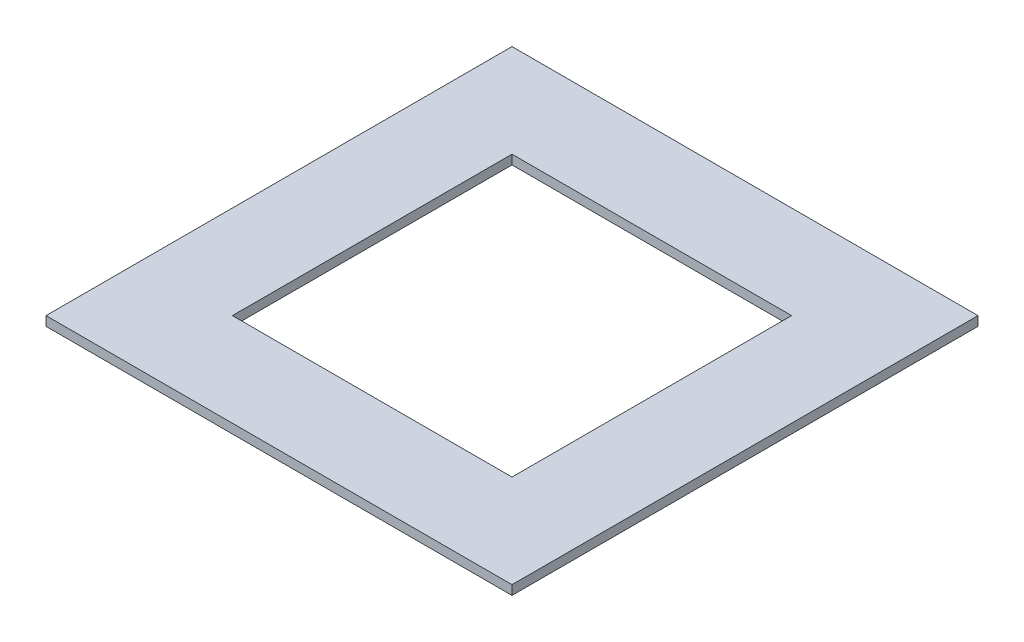
ISO-10303-21;
HEADER;
FILE_DESCRIPTION(('STEP AP214'),'2;1');
FILE_NAME('part.step','',(''),(''),'','','');
FILE_SCHEMA(('AUTOMOTIVE_DESIGN { 1 0 10303 214 1 1 1 1 }'));
ENDSEC;
DATA;
#1=APPLICATION_CONTEXT('core data for automotive mechanical design processes');
#2=APPLICATION_PROTOCOL_DEFINITION('international standard','automotive_design',2000,#1);
#3=PRODUCT_CONTEXT('',#1,'mechanical');
#4=PRODUCT('Part','Part','',(#3));
#5=PRODUCT_RELATED_PRODUCT_CATEGORY('part','',(#4));
#6=PRODUCT_DEFINITION_FORMATION('','',#4);
#7=PRODUCT_DEFINITION_CONTEXT('part definition',#1,'design');
#8=PRODUCT_DEFINITION('design','',#6,#7);
#9=PRODUCT_DEFINITION_SHAPE('','',#8);
#10=(LENGTH_UNIT() NAMED_UNIT(*) SI_UNIT(.MILLI.,.METRE.));
#11=(NAMED_UNIT(*) PLANE_ANGLE_UNIT() SI_UNIT($,.RADIAN.));
#12=(NAMED_UNIT(*) SI_UNIT($,.STERADIAN.) SOLID_ANGLE_UNIT());
#13=UNCERTAINTY_MEASURE_WITH_UNIT(LENGTH_MEASURE(1.E-05),#10,'distance_accuracy_value','');
#14=(GEOMETRIC_REPRESENTATION_CONTEXT(3) GLOBAL_UNCERTAINTY_ASSIGNED_CONTEXT((#13)) GLOBAL_UNIT_ASSIGNED_CONTEXT((#10,
#11,#12)) REPRESENTATION_CONTEXT('',''));
#15=CARTESIAN_POINT('',(0.,0.,0.));
#16=DIRECTION('',(0.,0.,1.));
#17=DIRECTION('',(1.,0.,0.));
#18=AXIS2_PLACEMENT_3D('',#15,#16,#17);
#19=CARTESIAN_POINT('',(0.,0.5,0.));
#20=DIRECTION('',(0.,-1.,0.));
#21=DIRECTION('',(0.,0.,-1.));
#22=AXIS2_PLACEMENT_3D('',#19,#20,#21);
#23=PLANE('',#22);
#24=DIRECTION('',(0.,0.,1.));
#25=VECTOR('',#24,1.);
#26=CARTESIAN_POINT('',(0.,0.5,0.));
#27=LINE('',#26,#25);
#28=CARTESIAN_POINT('',(0.,0.5,-25.));
#29=VERTEX_POINT('',#28);
#30=CARTESIAN_POINT('',(0.,0.5,0.));
#31=VERTEX_POINT('',#30);
#32=EDGE_CURVE('E134',#29,#31,#27,.T.);
#33=ORIENTED_EDGE('',*,*,#32,.T.);
#34=DIRECTION('',(1.,0.,0.));
#35=VECTOR('',#34,1.);
#36=CARTESIAN_POINT('',(0.,0.5,0.));
#37=LINE('',#36,#35);
#38=CARTESIAN_POINT('',(25.,0.5,0.));
#39=VERTEX_POINT('',#38);
#40=EDGE_CURVE('E137',#31,#39,#37,.T.);
#41=ORIENTED_EDGE('',*,*,#40,.T.);
#42=DIRECTION('',(0.,0.,-1.));
#43=VECTOR('',#42,1.);
#44=CARTESIAN_POINT('',(25.,0.5,0.));
#45=LINE('',#44,#43);
#46=CARTESIAN_POINT('',(25.,0.5,-25.));
#47=VERTEX_POINT('',#46);
#48=EDGE_CURVE('E140',#39,#47,#45,.T.);
#49=ORIENTED_EDGE('',*,*,#48,.T.);
#50=DIRECTION('',(-1.,0.,0.));
#51=VECTOR('',#50,1.);
#52=CARTESIAN_POINT('',(0.,0.5,-25.));
#53=LINE('',#52,#51);
#54=EDGE_CURVE('E142',#47,#29,#53,.T.);
#55=ORIENTED_EDGE('',*,*,#54,.T.);
#56=EDGE_LOOP('',(#33,#41,#49,#55));
#57=FACE_BOUND('',#56,.T.);
#58=DIRECTION('',(0.,0.,1.));
#59=VECTOR('',#58,1.);
#60=CARTESIAN_POINT('',(5.,0.5,-5.));
#61=LINE('',#60,#59);
#62=CARTESIAN_POINT('',(5.,0.5,-20.));
#63=VERTEX_POINT('',#62);
#64=CARTESIAN_POINT('',(5.,0.5,-5.));
#65=VERTEX_POINT('',#64);
#66=EDGE_CURVE('E98',#63,#65,#61,.T.);
#67=ORIENTED_EDGE('',*,*,#66,.F.);
#68=DIRECTION('',(-1.,0.,0.));
#69=VECTOR('',#68,1.);
#70=CARTESIAN_POINT('',(5.,0.5,-20.));
#71=LINE('',#70,#69);
#72=CARTESIAN_POINT('',(20.,0.5,-20.));
#73=VERTEX_POINT('',#72);
#74=EDGE_CURVE('E120',#73,#63,#71,.T.);
#75=ORIENTED_EDGE('',*,*,#74,.F.);
#76=DIRECTION('',(0.,0.,-1.));
#77=VECTOR('',#76,1.);
#78=CARTESIAN_POINT('',(20.,0.5,-5.));
#79=LINE('',#78,#77);
#80=CARTESIAN_POINT('',(20.,0.5,-5.));
#81=VERTEX_POINT('',#80);
#82=EDGE_CURVE('E118',#81,#73,#79,.T.);
#83=ORIENTED_EDGE('',*,*,#82,.F.);
#84=DIRECTION('',(1.,0.,0.));
#85=VECTOR('',#84,1.);
#86=CARTESIAN_POINT('',(5.,0.5,-5.));
#87=LINE('',#86,#85);
#88=EDGE_CURVE('E106',#65,#81,#87,.T.);
#89=ORIENTED_EDGE('',*,*,#88,.F.);
#90=EDGE_LOOP('',(#67,#75,#83,#89));
#91=FACE_BOUND('',#90,.T.);
#92=ADVANCED_FACE('F33',(#57,#91),#23,.F.);
#93=CARTESIAN_POINT('',(0.,0.,0.));
#94=DIRECTION('',(0.,-1.,0.));
#95=DIRECTION('',(0.,0.,-1.));
#96=AXIS2_PLACEMENT_3D('',#93,#94,#95);
#97=PLANE('',#96);
#98=DIRECTION('',(0.,0.,1.));
#99=VECTOR('',#98,1.);
#100=CARTESIAN_POINT('',(0.,0.,0.));
#101=LINE('',#100,#99);
#102=CARTESIAN_POINT('',(0.,0.,-25.));
#103=VERTEX_POINT('',#102);
#104=CARTESIAN_POINT('',(0.,0.,0.));
#105=VERTEX_POINT('',#104);
#106=EDGE_CURVE('E114',#103,#105,#101,.T.);
#107=ORIENTED_EDGE('',*,*,#106,.F.);
#108=DIRECTION('',(-1.,0.,0.));
#109=VECTOR('',#108,1.);
#110=CARTESIAN_POINT('',(0.,0.,-25.));
#111=LINE('',#110,#109);
#112=CARTESIAN_POINT('',(25.,0.,-25.));
#113=VERTEX_POINT('',#112);
#114=EDGE_CURVE('E138',#113,#103,#111,.T.);
#115=ORIENTED_EDGE('',*,*,#114,.F.);
#116=DIRECTION('',(0.,0.,-1.));
#117=VECTOR('',#116,1.);
#118=CARTESIAN_POINT('',(25.,0.,0.));
#119=LINE('',#118,#117);
#120=CARTESIAN_POINT('',(25.,0.,0.));
#121=VERTEX_POINT('',#120);
#122=EDGE_CURVE('E149',#121,#113,#119,.T.);
#123=ORIENTED_EDGE('',*,*,#122,.F.);
#124=DIRECTION('',(1.,0.,0.));
#125=VECTOR('',#124,1.);
#126=CARTESIAN_POINT('',(0.,0.,0.));
#127=LINE('',#126,#125);
#128=EDGE_CURVE('E147',#105,#121,#127,.T.);
#129=ORIENTED_EDGE('',*,*,#128,.F.);
#130=EDGE_LOOP('',(#107,#115,#123,#129));
#131=FACE_BOUND('',#130,.T.);
#132=DIRECTION('',(-1.,0.,0.));
#133=VECTOR('',#132,1.);
#134=CARTESIAN_POINT('',(5.,0.,-20.));
#135=LINE('',#134,#133);
#136=CARTESIAN_POINT('',(20.,0.,-20.));
#137=VERTEX_POINT('',#136);
#138=CARTESIAN_POINT('',(5.,0.,-20.));
#139=VERTEX_POINT('',#138);
#140=EDGE_CURVE('E107',#137,#139,#135,.T.);
#141=ORIENTED_EDGE('',*,*,#140,.T.);
#142=DIRECTION('',(0.,0.,1.));
#143=VECTOR('',#142,1.);
#144=CARTESIAN_POINT('',(5.,0.,-5.));
#145=LINE('',#144,#143);
#146=CARTESIAN_POINT('',(5.,0.,-5.));
#147=VERTEX_POINT('',#146);
#148=EDGE_CURVE('E56',#139,#147,#145,.T.);
#149=ORIENTED_EDGE('',*,*,#148,.T.);
#150=DIRECTION('',(1.,0.,0.));
#151=VECTOR('',#150,1.);
#152=CARTESIAN_POINT('',(5.,0.,-5.));
#153=LINE('',#152,#151);
#154=CARTESIAN_POINT('',(20.,0.,-5.));
#155=VERTEX_POINT('',#154);
#156=EDGE_CURVE('E113',#147,#155,#153,.T.);
#157=ORIENTED_EDGE('',*,*,#156,.T.);
#158=DIRECTION('',(0.,0.,-1.));
#159=VECTOR('',#158,1.);
#160=CARTESIAN_POINT('',(20.,0.,-5.));
#161=LINE('',#160,#159);
#162=EDGE_CURVE('E126',#155,#137,#161,.T.);
#163=ORIENTED_EDGE('',*,*,#162,.T.);
#164=EDGE_LOOP('',(#141,#149,#157,#163));
#165=FACE_BOUND('',#164,.T.);
#166=ADVANCED_FACE('F167',(#131,#165),#97,.T.);
#167=CARTESIAN_POINT('',(0.,0.5,0.));
#168=DIRECTION('',(1.,0.,0.));
#169=DIRECTION('',(0.,0.,-1.));
#170=AXIS2_PLACEMENT_3D('',#167,#168,#169);
#171=PLANE('',#170);
#172=ORIENTED_EDGE('',*,*,#106,.T.);
#173=DIRECTION('',(0.,-1.,0.));
#174=VECTOR('',#173,1.);
#175=CARTESIAN_POINT('',(0.,0.5,0.));
#176=LINE('',#175,#174);
#177=EDGE_CURVE('E11',#31,#105,#176,.T.);
#178=ORIENTED_EDGE('',*,*,#177,.F.);
#179=ORIENTED_EDGE('',*,*,#32,.F.);
#180=DIRECTION('',(0.,-1.,0.));
#181=VECTOR('',#180,1.);
#182=CARTESIAN_POINT('',(0.,0.5,-25.));
#183=LINE('',#182,#181);
#184=EDGE_CURVE('E144',#29,#103,#183,.T.);
#185=ORIENTED_EDGE('',*,*,#184,.T.);
#186=EDGE_LOOP('',(#172,#178,#179,#185));
#187=FACE_BOUND('',#186,.T.);
#188=ADVANCED_FACE('F35',(#187),#171,.F.);
#189=CARTESIAN_POINT('',(0.,0.5,0.));
#190=DIRECTION('',(0.,0.,-1.));
#191=DIRECTION('',(-1.,0.,0.));
#192=AXIS2_PLACEMENT_3D('',#189,#190,#191);
#193=PLANE('',#192);
#194=ORIENTED_EDGE('',*,*,#128,.T.);
#195=DIRECTION('',(0.,-1.,0.));
#196=VECTOR('',#195,1.);
#197=CARTESIAN_POINT('',(25.,0.5,0.));
#198=LINE('',#197,#196);
#199=EDGE_CURVE('E41',#39,#121,#198,.T.);
#200=ORIENTED_EDGE('',*,*,#199,.F.);
#201=ORIENTED_EDGE('',*,*,#40,.F.);
#202=ORIENTED_EDGE('',*,*,#177,.T.);
#203=EDGE_LOOP('',(#194,#200,#201,#202));
#204=FACE_BOUND('',#203,.T.);
#205=ADVANCED_FACE('F177',(#204),#193,.F.);
#206=CARTESIAN_POINT('',(25.,0.5,0.));
#207=DIRECTION('',(-1.,0.,0.));
#208=DIRECTION('',(0.,0.,1.));
#209=AXIS2_PLACEMENT_3D('',#206,#207,#208);
#210=PLANE('',#209);
#211=ORIENTED_EDGE('',*,*,#122,.T.);
#212=DIRECTION('',(0.,-1.,0.));
#213=VECTOR('',#212,1.);
#214=CARTESIAN_POINT('',(25.,0.5,-25.));
#215=LINE('',#214,#213);
#216=EDGE_CURVE('E154',#47,#113,#215,.T.);
#217=ORIENTED_EDGE('',*,*,#216,.F.);
#218=ORIENTED_EDGE('',*,*,#48,.F.);
#219=ORIENTED_EDGE('',*,*,#199,.T.);
#220=EDGE_LOOP('',(#211,#217,#218,#219));
#221=FACE_BOUND('',#220,.T.);
#222=ADVANCED_FACE('F161',(#221),#210,.F.);
#223=CARTESIAN_POINT('',(0.,0.5,-25.));
#224=DIRECTION('',(0.,0.,1.));
#225=DIRECTION('',(1.,0.,0.));
#226=AXIS2_PLACEMENT_3D('',#223,#224,#225);
#227=PLANE('',#226);
#228=ORIENTED_EDGE('',*,*,#114,.T.);
#229=ORIENTED_EDGE('',*,*,#184,.F.);
#230=ORIENTED_EDGE('',*,*,#54,.F.);
#231=ORIENTED_EDGE('',*,*,#216,.T.);
#232=EDGE_LOOP('',(#228,#229,#230,#231));
#233=FACE_BOUND('',#232,.T.);
#234=ADVANCED_FACE('F171',(#233),#227,.F.);
#235=CARTESIAN_POINT('',(5.,0.5,-5.));
#236=DIRECTION('',(1.,0.,0.));
#237=DIRECTION('',(0.,0.,-1.));
#238=AXIS2_PLACEMENT_3D('',#235,#236,#237);
#239=PLANE('',#238);
#240=ORIENTED_EDGE('',*,*,#148,.F.);
#241=DIRECTION('',(0.,-1.,0.));
#242=VECTOR('',#241,1.);
#243=CARTESIAN_POINT('',(5.,0.5,-20.));
#244=LINE('',#243,#242);
#245=EDGE_CURVE('E102',#63,#139,#244,.T.);
#246=ORIENTED_EDGE('',*,*,#245,.F.);
#247=ORIENTED_EDGE('',*,*,#66,.T.);
#248=DIRECTION('',(0.,-1.,0.));
#249=VECTOR('',#248,1.);
#250=CARTESIAN_POINT('',(5.,0.5,-5.));
#251=LINE('',#250,#249);
#252=EDGE_CURVE('E101',#65,#147,#251,.T.);
#253=ORIENTED_EDGE('',*,*,#252,.T.);
#254=EDGE_LOOP('',(#240,#246,#247,#253));
#255=FACE_BOUND('',#254,.T.);
#256=ADVANCED_FACE('F100',(#255),#239,.T.);
#257=CARTESIAN_POINT('',(5.,0.5,-5.));
#258=DIRECTION('',(0.,0.,-1.));
#259=DIRECTION('',(-1.,0.,0.));
#260=AXIS2_PLACEMENT_3D('',#257,#258,#259);
#261=PLANE('',#260);
#262=ORIENTED_EDGE('',*,*,#156,.F.);
#263=ORIENTED_EDGE('',*,*,#252,.F.);
#264=ORIENTED_EDGE('',*,*,#88,.T.);
#265=DIRECTION('',(0.,-1.,0.));
#266=VECTOR('',#265,1.);
#267=CARTESIAN_POINT('',(20.,0.5,-5.));
#268=LINE('',#267,#266);
#269=EDGE_CURVE('E115',#81,#155,#268,.T.);
#270=ORIENTED_EDGE('',*,*,#269,.T.);
#271=EDGE_LOOP('',(#262,#263,#264,#270));
#272=FACE_BOUND('',#271,.T.);
#273=ADVANCED_FACE('F110',(#272),#261,.T.);
#274=CARTESIAN_POINT('',(20.,0.5,-5.));
#275=DIRECTION('',(-1.,0.,0.));
#276=DIRECTION('',(0.,0.,1.));
#277=AXIS2_PLACEMENT_3D('',#274,#275,#276);
#278=PLANE('',#277);
#279=ORIENTED_EDGE('',*,*,#162,.F.);
#280=ORIENTED_EDGE('',*,*,#269,.F.);
#281=ORIENTED_EDGE('',*,*,#82,.T.);
#282=DIRECTION('',(0.,-1.,0.));
#283=VECTOR('',#282,1.);
#284=CARTESIAN_POINT('',(20.,0.5,-20.));
#285=LINE('',#284,#283);
#286=EDGE_CURVE('E48',#73,#137,#285,.T.);
#287=ORIENTED_EDGE('',*,*,#286,.T.);
#288=EDGE_LOOP('',(#279,#280,#281,#287));
#289=FACE_BOUND('',#288,.T.);
#290=ADVANCED_FACE('F200',(#289),#278,.T.);
#291=CARTESIAN_POINT('',(5.,0.5,-20.));
#292=DIRECTION('',(0.,0.,1.));
#293=DIRECTION('',(1.,0.,0.));
#294=AXIS2_PLACEMENT_3D('',#291,#292,#293);
#295=PLANE('',#294);
#296=ORIENTED_EDGE('',*,*,#140,.F.);
#297=ORIENTED_EDGE('',*,*,#286,.F.);
#298=ORIENTED_EDGE('',*,*,#74,.T.);
#299=ORIENTED_EDGE('',*,*,#245,.T.);
#300=EDGE_LOOP('',(#296,#297,#298,#299));
#301=FACE_BOUND('',#300,.T.);
#302=ADVANCED_FACE('F204',(#301),#295,.T.);
#303=CLOSED_SHELL('',(#92,#166,#188,#205,#222,#234,#256,#273,#290,#302));
#304=MANIFOLD_SOLID_BREP('B2',#303);
#305=ADVANCED_BREP_SHAPE_REPRESENTATION('',(#18,#304),#14);
#306=SHAPE_DEFINITION_REPRESENTATION(#9,#305);
ENDSEC;
END-ISO-10303-21;
